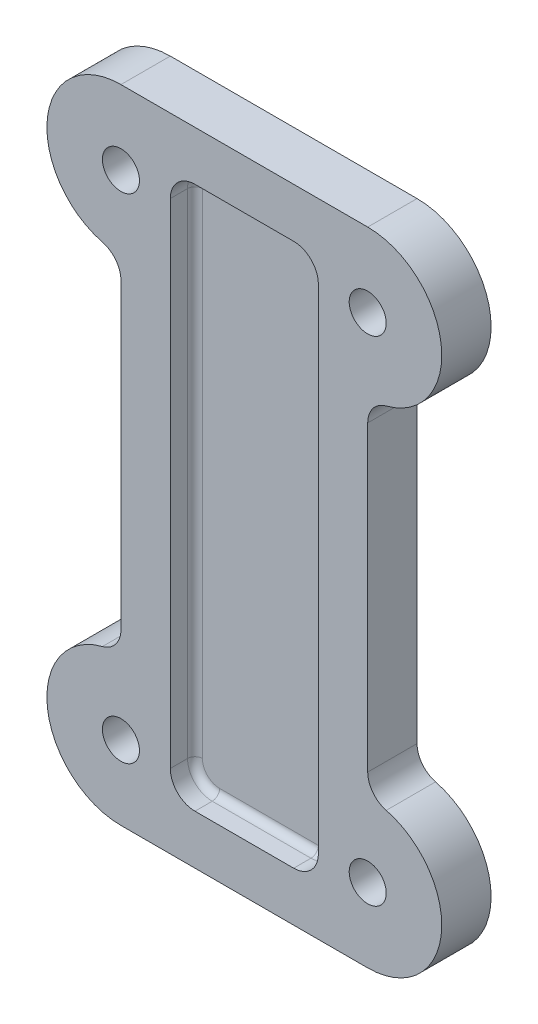
ISO-10303-21;
HEADER;
FILE_DESCRIPTION(('STEP AP214'),'2;1');
FILE_NAME('part.step','',(''),(''),'','','');
FILE_SCHEMA(('AUTOMOTIVE_DESIGN { 1 0 10303 214 1 1 1 1 }'));
ENDSEC;
DATA;
#1=APPLICATION_CONTEXT('core data for automotive mechanical design processes');
#2=APPLICATION_PROTOCOL_DEFINITION('international standard','automotive_design',2000,#1);
#3=PRODUCT_CONTEXT('',#1,'mechanical');
#4=PRODUCT('Part','Part','',(#3));
#5=PRODUCT_RELATED_PRODUCT_CATEGORY('part','',(#4));
#6=PRODUCT_DEFINITION_FORMATION('','',#4);
#7=PRODUCT_DEFINITION_CONTEXT('part definition',#1,'design');
#8=PRODUCT_DEFINITION('design','',#6,#7);
#9=PRODUCT_DEFINITION_SHAPE('','',#8);
#10=(LENGTH_UNIT() NAMED_UNIT(*) SI_UNIT(.MILLI.,.METRE.));
#11=(NAMED_UNIT(*) PLANE_ANGLE_UNIT() SI_UNIT($,.RADIAN.));
#12=(NAMED_UNIT(*) SI_UNIT($,.STERADIAN.) SOLID_ANGLE_UNIT());
#13=UNCERTAINTY_MEASURE_WITH_UNIT(LENGTH_MEASURE(1.E-05),#10,'distance_accuracy_value','');
#14=(GEOMETRIC_REPRESENTATION_CONTEXT(3) GLOBAL_UNCERTAINTY_ASSIGNED_CONTEXT((#13)) GLOBAL_UNIT_ASSIGNED_CONTEXT((#10,
#11,#12)) REPRESENTATION_CONTEXT('',''));
#15=CARTESIAN_POINT('',(0.,0.,0.));
#16=DIRECTION('',(0.,0.,1.));
#17=DIRECTION('',(1.,0.,0.));
#18=AXIS2_PLACEMENT_3D('',#15,#16,#17);
#19=CARTESIAN_POINT('',(0.,-41.275,3.175));
#20=DIRECTION('',(0.,-1.,0.));
#21=DIRECTION('',(0.,0.,-1.));
#22=AXIS2_PLACEMENT_3D('',#19,#20,#21);
#23=PLANE('',#22);
#24=DIRECTION('',(-1.,0.,0.));
#25=VECTOR('',#24,1.);
#26=CARTESIAN_POINT('',(0.,-41.275,0.));
#27=LINE('',#26,#25);
#28=CARTESIAN_POINT('',(15.875,-41.275,0.));
#29=VERTEX_POINT('',#28);
#30=CARTESIAN_POINT('',(-15.875,-41.275,0.));
#31=VERTEX_POINT('',#30);
#32=EDGE_CURVE('E201',#29,#31,#27,.T.);
#33=ORIENTED_EDGE('',*,*,#32,.F.);
#34=DIRECTION('',(0.,0.,-1.));
#35=VECTOR('',#34,1.);
#36=CARTESIAN_POINT('',(15.875,-41.275,3.175));
#37=LINE('',#36,#35);
#38=CARTESIAN_POINT('',(15.875,-41.275,6.35));
#39=VERTEX_POINT('',#38);
#40=EDGE_CURVE('E196',#39,#29,#37,.T.);
#41=ORIENTED_EDGE('',*,*,#40,.F.);
#42=DIRECTION('',(1.,0.,0.));
#43=VECTOR('',#42,1.);
#44=CARTESIAN_POINT('',(0.,-41.275,6.35));
#45=LINE('',#44,#43);
#46=CARTESIAN_POINT('',(-15.875,-41.275,6.35));
#47=VERTEX_POINT('',#46);
#48=EDGE_CURVE('E199',#47,#39,#45,.T.);
#49=ORIENTED_EDGE('',*,*,#48,.F.);
#50=DIRECTION('',(0.,0.,-1.));
#51=VECTOR('',#50,1.);
#52=CARTESIAN_POINT('',(-15.875,-41.275,3.175));
#53=LINE('',#52,#51);
#54=EDGE_CURVE('E352',#47,#31,#53,.T.);
#55=ORIENTED_EDGE('',*,*,#54,.T.);
#56=EDGE_LOOP('',(#33,#41,#49,#55));
#57=FACE_BOUND('',#56,.T.);
#58=ADVANCED_FACE('F33',(#57),#23,.T.);
#59=CARTESIAN_POINT('',(15.875,-31.75,3.175));
#60=DIRECTION('',(0.,0.,-1.));
#61=DIRECTION('',(-1.,0.,0.));
#62=AXIS2_PLACEMENT_3D('',#59,#60,#61);
#63=CYLINDRICAL_SURFACE('',#62,9.525);
#64=CARTESIAN_POINT('',(15.875,-31.75,0.));
#65=DIRECTION('',(0.,0.,1.));
#66=DIRECTION('',(1.,0.,0.));
#67=AXIS2_PLACEMENT_3D('',#64,#65,#66);
#68=CIRCLE('',#67,9.525);
#69=CARTESIAN_POINT('',(18.25625,-22.5274584068436,0.));
#70=VERTEX_POINT('',#69);
#71=EDGE_CURVE('E311',#29,#70,#68,.T.);
#72=ORIENTED_EDGE('',*,*,#71,.T.);
#73=DIRECTION('',(0.,0.,-1.));
#74=VECTOR('',#73,1.);
#75=CARTESIAN_POINT('',(18.25625,-22.5274584068436,3.175));
#76=LINE('',#75,#74);
#77=CARTESIAN_POINT('',(18.25625,-22.5274584068436,6.35));
#78=VERTEX_POINT('',#77);
#79=EDGE_CURVE('E206',#78,#70,#76,.T.);
#80=ORIENTED_EDGE('',*,*,#79,.F.);
#81=CARTESIAN_POINT('',(15.875,-31.75,6.35));
#82=DIRECTION('',(0.,0.,1.));
#83=DIRECTION('',(1.,0.,0.));
#84=AXIS2_PLACEMENT_3D('',#81,#82,#83);
#85=CIRCLE('',#84,9.525);
#86=EDGE_CURVE('E209',#39,#78,#85,.T.);
#87=ORIENTED_EDGE('',*,*,#86,.F.);
#88=ORIENTED_EDGE('',*,*,#40,.T.);
#89=EDGE_LOOP('',(#72,#80,#87,#88));
#90=FACE_BOUND('',#89,.T.);
#91=ADVANCED_FACE('F210',(#90),#63,.T.);
#92=CARTESIAN_POINT('',(19.05,-19.4532778757914,3.175));
#93=DIRECTION('',(0.,0.,-1.));
#94=DIRECTION('',(-1.,0.,0.));
#95=AXIS2_PLACEMENT_3D('',#92,#93,#94);
#96=CYLINDRICAL_SURFACE('',#95,3.175);
#97=CARTESIAN_POINT('',(19.05,-19.4532778757914,0.));
#98=DIRECTION('',(0.,0.,1.));
#99=DIRECTION('',(1.,0.,0.));
#100=AXIS2_PLACEMENT_3D('',#97,#98,#99);
#101=CIRCLE('',#100,3.175);
#102=CARTESIAN_POINT('',(15.875,-19.4532778757914,0.));
#103=VERTEX_POINT('',#102);
#104=EDGE_CURVE('E313',#70,#103,#101,.F.);
#105=ORIENTED_EDGE('',*,*,#104,.T.);
#106=DIRECTION('',(0.,0.,-1.));
#107=VECTOR('',#106,1.);
#108=CARTESIAN_POINT('',(15.875,-19.4532778757914,3.175));
#109=LINE('',#108,#107);
#110=CARTESIAN_POINT('',(15.875,-19.4532778757914,6.35));
#111=VERTEX_POINT('',#110);
#112=EDGE_CURVE('E373',#111,#103,#109,.T.);
#113=ORIENTED_EDGE('',*,*,#112,.F.);
#114=CARTESIAN_POINT('',(19.05,-19.4532778757914,6.35));
#115=DIRECTION('',(0.,0.,1.));
#116=DIRECTION('',(1.,0.,0.));
#117=AXIS2_PLACEMENT_3D('',#114,#115,#116);
#118=CIRCLE('',#117,3.175);
#119=EDGE_CURVE('E215',#78,#111,#118,.F.);
#120=ORIENTED_EDGE('',*,*,#119,.F.);
#121=ORIENTED_EDGE('',*,*,#79,.T.);
#122=EDGE_LOOP('',(#105,#113,#120,#121));
#123=FACE_BOUND('',#122,.T.);
#124=ADVANCED_FACE('F487',(#123),#96,.F.);
#125=CARTESIAN_POINT('',(15.875,0.,3.175));
#126=DIRECTION('',(-1.,0.,0.));
#127=DIRECTION('',(0.,0.,1.));
#128=AXIS2_PLACEMENT_3D('',#125,#126,#127);
#129=PLANE('',#128);
#130=DIRECTION('',(0.,1.,0.));
#131=VECTOR('',#130,1.);
#132=CARTESIAN_POINT('',(15.875,0.,0.));
#133=LINE('',#132,#131);
#134=CARTESIAN_POINT('',(15.875,19.4532778757914,0.));
#135=VERTEX_POINT('',#134);
#136=EDGE_CURVE('E316',#103,#135,#133,.T.);
#137=ORIENTED_EDGE('',*,*,#136,.T.);
#138=DIRECTION('',(0.,0.,-1.));
#139=VECTOR('',#138,1.);
#140=CARTESIAN_POINT('',(15.875,19.4532778757914,3.175));
#141=LINE('',#140,#139);
#142=CARTESIAN_POINT('',(15.875,19.4532778757914,6.35));
#143=VERTEX_POINT('',#142);
#144=EDGE_CURVE('E371',#143,#135,#141,.T.);
#145=ORIENTED_EDGE('',*,*,#144,.F.);
#146=DIRECTION('',(0.,1.,0.));
#147=VECTOR('',#146,1.);
#148=CARTESIAN_POINT('',(15.875,0.,6.35));
#149=LINE('',#148,#147);
#150=EDGE_CURVE('E228',#111,#143,#149,.T.);
#151=ORIENTED_EDGE('',*,*,#150,.F.);
#152=ORIENTED_EDGE('',*,*,#112,.T.);
#153=EDGE_LOOP('',(#137,#145,#151,#152));
#154=FACE_BOUND('',#153,.T.);
#155=ADVANCED_FACE('F748',(#154),#129,.F.);
#156=CARTESIAN_POINT('',(19.05,19.4532778757914,3.175));
#157=DIRECTION('',(0.,0.,-1.));
#158=DIRECTION('',(-1.,0.,0.));
#159=AXIS2_PLACEMENT_3D('',#156,#157,#158);
#160=CYLINDRICAL_SURFACE('',#159,3.175);
#161=CARTESIAN_POINT('',(19.05,19.4532778757914,0.));
#162=DIRECTION('',(0.,0.,1.));
#163=DIRECTION('',(1.,0.,0.));
#164=AXIS2_PLACEMENT_3D('',#161,#162,#163);
#165=CIRCLE('',#164,3.175);
#166=CARTESIAN_POINT('',(18.25625,22.5274584068436,0.));
#167=VERTEX_POINT('',#166);
#168=EDGE_CURVE('E319',#167,#135,#165,.T.);
#169=ORIENTED_EDGE('',*,*,#168,.F.);
#170=DIRECTION('',(0.,0.,-1.));
#171=VECTOR('',#170,1.);
#172=CARTESIAN_POINT('',(18.25625,22.5274584068436,3.175));
#173=LINE('',#172,#171);
#174=CARTESIAN_POINT('',(18.25625,22.5274584068436,6.35));
#175=VERTEX_POINT('',#174);
#176=EDGE_CURVE('E369',#175,#167,#173,.T.);
#177=ORIENTED_EDGE('',*,*,#176,.F.);
#178=CARTESIAN_POINT('',(19.05,19.4532778757914,6.35));
#179=DIRECTION('',(0.,0.,1.));
#180=DIRECTION('',(1.,0.,0.));
#181=AXIS2_PLACEMENT_3D('',#178,#179,#180);
#182=CIRCLE('',#181,3.175);
#183=EDGE_CURVE('E231',#143,#175,#182,.F.);
#184=ORIENTED_EDGE('',*,*,#183,.F.);
#185=ORIENTED_EDGE('',*,*,#144,.T.);
#186=EDGE_LOOP('',(#169,#177,#184,#185));
#187=FACE_BOUND('',#186,.T.);
#188=ADVANCED_FACE('F737',(#187),#160,.F.);
#189=CARTESIAN_POINT('',(15.875,31.75,3.175));
#190=DIRECTION('',(0.,0.,-1.));
#191=DIRECTION('',(-1.,0.,0.));
#192=AXIS2_PLACEMENT_3D('',#189,#190,#191);
#193=CYLINDRICAL_SURFACE('',#192,9.52500000000001);
#194=CARTESIAN_POINT('',(15.875,31.75,0.));
#195=DIRECTION('',(0.,0.,1.));
#196=DIRECTION('',(1.,0.,0.));
#197=AXIS2_PLACEMENT_3D('',#194,#195,#196);
#198=CIRCLE('',#197,9.52500000000001);
#199=CARTESIAN_POINT('',(15.875,41.275,0.));
#200=VERTEX_POINT('',#199);
#201=EDGE_CURVE('E322',#167,#200,#198,.T.);
#202=ORIENTED_EDGE('',*,*,#201,.T.);
#203=DIRECTION('',(0.,0.,-1.));
#204=VECTOR('',#203,1.);
#205=CARTESIAN_POINT('',(15.875,41.275,3.175));
#206=LINE('',#205,#204);
#207=CARTESIAN_POINT('',(15.875,41.275,6.35));
#208=VERTEX_POINT('',#207);
#209=EDGE_CURVE('E366',#208,#200,#206,.T.);
#210=ORIENTED_EDGE('',*,*,#209,.F.);
#211=CARTESIAN_POINT('',(15.875,31.75,6.35));
#212=DIRECTION('',(0.,0.,1.));
#213=DIRECTION('',(1.,0.,0.));
#214=AXIS2_PLACEMENT_3D('',#211,#212,#213);
#215=CIRCLE('',#214,9.52500000000001);
#216=EDGE_CURVE('E234',#175,#208,#215,.T.);
#217=ORIENTED_EDGE('',*,*,#216,.F.);
#218=ORIENTED_EDGE('',*,*,#176,.T.);
#219=EDGE_LOOP('',(#202,#210,#217,#218));
#220=FACE_BOUND('',#219,.T.);
#221=ADVANCED_FACE('F726',(#220),#193,.T.);
#222=CARTESIAN_POINT('',(0.,41.275,3.175));
#223=DIRECTION('',(0.,-1.,0.));
#224=DIRECTION('',(0.,0.,-1.));
#225=AXIS2_PLACEMENT_3D('',#222,#223,#224);
#226=PLANE('',#225);
#227=DIRECTION('',(-1.,0.,0.));
#228=VECTOR('',#227,1.);
#229=CARTESIAN_POINT('',(0.,41.275,0.));
#230=LINE('',#229,#228);
#231=CARTESIAN_POINT('',(-15.875,41.275,0.));
#232=VERTEX_POINT('',#231);
#233=EDGE_CURVE('E325',#200,#232,#230,.T.);
#234=ORIENTED_EDGE('',*,*,#233,.T.);
#235=DIRECTION('',(0.,0.,-1.));
#236=VECTOR('',#235,1.);
#237=CARTESIAN_POINT('',(-15.875,41.275,3.175));
#238=LINE('',#237,#236);
#239=CARTESIAN_POINT('',(-15.875,41.275,6.35));
#240=VERTEX_POINT('',#239);
#241=EDGE_CURVE('E363',#240,#232,#238,.T.);
#242=ORIENTED_EDGE('',*,*,#241,.F.);
#243=DIRECTION('',(-1.,0.,0.));
#244=VECTOR('',#243,1.);
#245=CARTESIAN_POINT('',(0.,41.275,6.35));
#246=LINE('',#245,#244);
#247=EDGE_CURVE('E237',#208,#240,#246,.T.);
#248=ORIENTED_EDGE('',*,*,#247,.F.);
#249=ORIENTED_EDGE('',*,*,#209,.T.);
#250=EDGE_LOOP('',(#234,#242,#248,#249));
#251=FACE_BOUND('',#250,.T.);
#252=ADVANCED_FACE('F715',(#251),#226,.F.);
#253=CARTESIAN_POINT('',(-15.875,31.75,3.175));
#254=DIRECTION('',(0.,0.,-1.));
#255=DIRECTION('',(-1.,0.,0.));
#256=AXIS2_PLACEMENT_3D('',#253,#254,#255);
#257=CYLINDRICAL_SURFACE('',#256,9.52500000000001);
#258=CARTESIAN_POINT('',(-15.875,31.75,0.));
#259=DIRECTION('',(0.,0.,1.));
#260=DIRECTION('',(1.,0.,0.));
#261=AXIS2_PLACEMENT_3D('',#258,#259,#260);
#262=CIRCLE('',#261,9.52500000000001);
#263=CARTESIAN_POINT('',(-18.25625,22.5274584068436,0.));
#264=VERTEX_POINT('',#263);
#265=EDGE_CURVE('E328',#232,#264,#262,.T.);
#266=ORIENTED_EDGE('',*,*,#265,.T.);
#267=DIRECTION('',(0.,0.,-1.));
#268=VECTOR('',#267,1.);
#269=CARTESIAN_POINT('',(-18.25625,22.5274584068436,3.175));
#270=LINE('',#269,#268);
#271=CARTESIAN_POINT('',(-18.25625,22.5274584068436,6.35));
#272=VERTEX_POINT('',#271);
#273=EDGE_CURVE('E360',#272,#264,#270,.T.);
#274=ORIENTED_EDGE('',*,*,#273,.F.);
#275=CARTESIAN_POINT('',(-15.875,31.75,6.35));
#276=DIRECTION('',(0.,0.,1.));
#277=DIRECTION('',(1.,0.,0.));
#278=AXIS2_PLACEMENT_3D('',#275,#276,#277);
#279=CIRCLE('',#278,9.52500000000001);
#280=EDGE_CURVE('E240',#240,#272,#279,.T.);
#281=ORIENTED_EDGE('',*,*,#280,.F.);
#282=ORIENTED_EDGE('',*,*,#241,.T.);
#283=EDGE_LOOP('',(#266,#274,#281,#282));
#284=FACE_BOUND('',#283,.T.);
#285=ADVANCED_FACE('F704',(#284),#257,.T.);
#286=CARTESIAN_POINT('',(-19.05,19.4532778757914,3.175));
#287=DIRECTION('',(0.,0.,-1.));
#288=DIRECTION('',(-1.,0.,0.));
#289=AXIS2_PLACEMENT_3D('',#286,#287,#288);
#290=CYLINDRICAL_SURFACE('',#289,3.175);
#291=CARTESIAN_POINT('',(-19.05,19.4532778757914,0.));
#292=DIRECTION('',(0.,0.,1.));
#293=DIRECTION('',(1.,0.,0.));
#294=AXIS2_PLACEMENT_3D('',#291,#292,#293);
#295=CIRCLE('',#294,3.175);
#296=CARTESIAN_POINT('',(-15.875,19.4532778757914,0.));
#297=VERTEX_POINT('',#296);
#298=EDGE_CURVE('E331',#264,#297,#295,.F.);
#299=ORIENTED_EDGE('',*,*,#298,.T.);
#300=DIRECTION('',(0.,0.,-1.));
#301=VECTOR('',#300,1.);
#302=CARTESIAN_POINT('',(-15.875,19.4532778757914,3.175));
#303=LINE('',#302,#301);
#304=CARTESIAN_POINT('',(-15.875,19.4532778757914,6.35));
#305=VERTEX_POINT('',#304);
#306=EDGE_CURVE('E358',#305,#297,#303,.T.);
#307=ORIENTED_EDGE('',*,*,#306,.F.);
#308=CARTESIAN_POINT('',(-19.05,19.4532778757914,6.35));
#309=DIRECTION('',(0.,0.,1.));
#310=DIRECTION('',(1.,0.,0.));
#311=AXIS2_PLACEMENT_3D('',#308,#309,#310);
#312=CIRCLE('',#311,3.175);
#313=EDGE_CURVE('E243',#272,#305,#312,.F.);
#314=ORIENTED_EDGE('',*,*,#313,.F.);
#315=ORIENTED_EDGE('',*,*,#273,.T.);
#316=EDGE_LOOP('',(#299,#307,#314,#315));
#317=FACE_BOUND('',#316,.T.);
#318=ADVANCED_FACE('F693',(#317),#290,.F.);
#319=CARTESIAN_POINT('',(-15.875,0.,3.175));
#320=DIRECTION('',(-1.,0.,0.));
#321=DIRECTION('',(0.,0.,1.));
#322=AXIS2_PLACEMENT_3D('',#319,#320,#321);
#323=PLANE('',#322);
#324=DIRECTION('',(0.,1.,0.));
#325=VECTOR('',#324,1.);
#326=CARTESIAN_POINT('',(-15.875,0.,0.));
#327=LINE('',#326,#325);
#328=CARTESIAN_POINT('',(-15.875,-19.4532778757914,0.));
#329=VERTEX_POINT('',#328);
#330=EDGE_CURVE('E334',#329,#297,#327,.T.);
#331=ORIENTED_EDGE('',*,*,#330,.F.);
#332=DIRECTION('',(0.,0.,-1.));
#333=VECTOR('',#332,1.);
#334=CARTESIAN_POINT('',(-15.875,-19.4532778757914,3.175));
#335=LINE('',#334,#333);
#336=CARTESIAN_POINT('',(-15.875,-19.4532778757914,6.35));
#337=VERTEX_POINT('',#336);
#338=EDGE_CURVE('E356',#337,#329,#335,.T.);
#339=ORIENTED_EDGE('',*,*,#338,.F.);
#340=DIRECTION('',(0.,-1.,0.));
#341=VECTOR('',#340,1.);
#342=CARTESIAN_POINT('',(-15.875,0.,6.35));
#343=LINE('',#342,#341);
#344=EDGE_CURVE('E246',#305,#337,#343,.T.);
#345=ORIENTED_EDGE('',*,*,#344,.F.);
#346=ORIENTED_EDGE('',*,*,#306,.T.);
#347=EDGE_LOOP('',(#331,#339,#345,#346));
#348=FACE_BOUND('',#347,.T.);
#349=ADVANCED_FACE('F682',(#348),#323,.T.);
#350=CARTESIAN_POINT('',(-19.05,-19.4532778757914,3.175));
#351=DIRECTION('',(0.,0.,-1.));
#352=DIRECTION('',(-1.,0.,0.));
#353=AXIS2_PLACEMENT_3D('',#350,#351,#352);
#354=CYLINDRICAL_SURFACE('',#353,3.175);
#355=CARTESIAN_POINT('',(-19.05,-19.4532778757914,0.));
#356=DIRECTION('',(0.,0.,1.));
#357=DIRECTION('',(1.,0.,0.));
#358=AXIS2_PLACEMENT_3D('',#355,#356,#357);
#359=CIRCLE('',#358,3.175);
#360=CARTESIAN_POINT('',(-18.25625,-22.5274584068436,0.));
#361=VERTEX_POINT('',#360);
#362=EDGE_CURVE('E337',#361,#329,#359,.T.);
#363=ORIENTED_EDGE('',*,*,#362,.F.);
#364=DIRECTION('',(0.,0.,-1.));
#365=VECTOR('',#364,1.);
#366=CARTESIAN_POINT('',(-18.25625,-22.5274584068436,3.175));
#367=LINE('',#366,#365);
#368=CARTESIAN_POINT('',(-18.25625,-22.5274584068436,6.35));
#369=VERTEX_POINT('',#368);
#370=EDGE_CURVE('E354',#369,#361,#367,.T.);
#371=ORIENTED_EDGE('',*,*,#370,.F.);
#372=CARTESIAN_POINT('',(-19.05,-19.4532778757914,6.35));
#373=DIRECTION('',(0.,0.,1.));
#374=DIRECTION('',(1.,0.,0.));
#375=AXIS2_PLACEMENT_3D('',#372,#373,#374);
#376=CIRCLE('',#375,3.175);
#377=EDGE_CURVE('E249',#337,#369,#376,.F.);
#378=ORIENTED_EDGE('',*,*,#377,.F.);
#379=ORIENTED_EDGE('',*,*,#338,.T.);
#380=EDGE_LOOP('',(#363,#371,#378,#379));
#381=FACE_BOUND('',#380,.T.);
#382=ADVANCED_FACE('F671',(#381),#354,.F.);
#383=CARTESIAN_POINT('',(15.875,31.75,3.175));
#384=DIRECTION('',(0.,0.,-1.));
#385=DIRECTION('',(-1.,0.,0.));
#386=AXIS2_PLACEMENT_3D('',#383,#384,#385);
#387=CYLINDRICAL_SURFACE('',#386,2.38125);
#388=CARTESIAN_POINT('',(15.875,31.75,0.));
#389=DIRECTION('',(0.,0.,1.));
#390=DIRECTION('',(1.,0.,0.));
#391=AXIS2_PLACEMENT_3D('',#388,#389,#390);
#392=CIRCLE('',#391,2.38125);
#393=CARTESIAN_POINT('',(18.25625,31.75,0.));
#394=VERTEX_POINT('',#393);
#395=EDGE_CURVE('E346',#394,#394,#392,.T.);
#396=ORIENTED_EDGE('',*,*,#395,.F.);
#397=EDGE_LOOP('',(#396));
#398=FACE_BOUND('',#397,.T.);
#399=CARTESIAN_POINT('',(15.875,31.75,6.35));
#400=DIRECTION('',(0.,0.,1.));
#401=DIRECTION('',(1.,0.,0.));
#402=AXIS2_PLACEMENT_3D('',#399,#400,#401);
#403=CIRCLE('',#402,2.38125);
#404=CARTESIAN_POINT('',(18.25625,31.75,6.35));
#405=VERTEX_POINT('',#404);
#406=EDGE_CURVE('E252',#405,#405,#403,.F.);
#407=ORIENTED_EDGE('',*,*,#406,.F.);
#408=EDGE_LOOP('',(#407));
#409=FACE_BOUND('',#408,.T.);
#410=ADVANCED_FACE('F660',(#398,#409),#387,.F.);
#411=CARTESIAN_POINT('',(15.875,-31.75,3.175));
#412=DIRECTION('',(0.,0.,-1.));
#413=DIRECTION('',(-1.,0.,0.));
#414=AXIS2_PLACEMENT_3D('',#411,#412,#413);
#415=CYLINDRICAL_SURFACE('',#414,2.38125);
#416=CARTESIAN_POINT('',(15.875,-31.75,0.));
#417=DIRECTION('',(0.,0.,1.));
#418=DIRECTION('',(1.,0.,0.));
#419=AXIS2_PLACEMENT_3D('',#416,#417,#418);
#420=CIRCLE('',#419,2.38125);
#421=CARTESIAN_POINT('',(18.25625,-31.75,0.));
#422=VERTEX_POINT('',#421);
#423=EDGE_CURVE('E343',#422,#422,#420,.T.);
#424=ORIENTED_EDGE('',*,*,#423,.F.);
#425=EDGE_LOOP('',(#424));
#426=FACE_BOUND('',#425,.T.);
#427=CARTESIAN_POINT('',(15.875,-31.75,6.35));
#428=DIRECTION('',(0.,0.,1.));
#429=DIRECTION('',(1.,0.,0.));
#430=AXIS2_PLACEMENT_3D('',#427,#428,#429);
#431=CIRCLE('',#430,2.38125);
#432=CARTESIAN_POINT('',(18.25625,-31.75,6.35));
#433=VERTEX_POINT('',#432);
#434=EDGE_CURVE('E255',#433,#433,#431,.F.);
#435=ORIENTED_EDGE('',*,*,#434,.F.);
#436=EDGE_LOOP('',(#435));
#437=FACE_BOUND('',#436,.T.);
#438=ADVANCED_FACE('F649',(#426,#437),#415,.F.);
#439=CARTESIAN_POINT('',(-15.875,-31.75,3.175));
#440=DIRECTION('',(0.,0.,-1.));
#441=DIRECTION('',(-1.,0.,0.));
#442=AXIS2_PLACEMENT_3D('',#439,#440,#441);
#443=CYLINDRICAL_SURFACE('',#442,9.525);
#444=CARTESIAN_POINT('',(-15.875,-31.75,0.));
#445=DIRECTION('',(0.,0.,1.));
#446=DIRECTION('',(1.,0.,0.));
#447=AXIS2_PLACEMENT_3D('',#444,#445,#446);
#448=CIRCLE('',#447,9.525);
#449=EDGE_CURVE('E340',#361,#31,#448,.T.);
#450=ORIENTED_EDGE('',*,*,#449,.T.);
#451=ORIENTED_EDGE('',*,*,#54,.F.);
#452=CARTESIAN_POINT('',(-15.875,-31.75,6.35));
#453=DIRECTION('',(0.,0.,1.));
#454=DIRECTION('',(1.,0.,0.));
#455=AXIS2_PLACEMENT_3D('',#452,#453,#454);
#456=CIRCLE('',#455,9.525);
#457=EDGE_CURVE('E222',#369,#47,#456,.T.);
#458=ORIENTED_EDGE('',*,*,#457,.F.);
#459=ORIENTED_EDGE('',*,*,#370,.T.);
#460=EDGE_LOOP('',(#450,#451,#458,#459));
#461=FACE_BOUND('',#460,.T.);
#462=ADVANCED_FACE('F495',(#461),#443,.T.);
#463=CARTESIAN_POINT('',(-15.875,-31.75,3.175));
#464=DIRECTION('',(0.,0.,-1.));
#465=DIRECTION('',(-1.,0.,0.));
#466=AXIS2_PLACEMENT_3D('',#463,#464,#465);
#467=CYLINDRICAL_SURFACE('',#466,2.38125);
#468=CARTESIAN_POINT('',(-15.875,-31.75,0.));
#469=DIRECTION('',(0.,0.,1.));
#470=DIRECTION('',(1.,0.,0.));
#471=AXIS2_PLACEMENT_3D('',#468,#469,#470);
#472=CIRCLE('',#471,2.38125);
#473=CARTESIAN_POINT('',(-13.49375,-31.75,0.));
#474=VERTEX_POINT('',#473);
#475=EDGE_CURVE('E307',#474,#474,#472,.T.);
#476=ORIENTED_EDGE('',*,*,#475,.F.);
#477=EDGE_LOOP('',(#476));
#478=FACE_BOUND('',#477,.T.);
#479=CARTESIAN_POINT('',(-15.875,-31.75,6.35));
#480=DIRECTION('',(0.,0.,1.));
#481=DIRECTION('',(1.,0.,0.));
#482=AXIS2_PLACEMENT_3D('',#479,#480,#481);
#483=CIRCLE('',#482,2.38125);
#484=CARTESIAN_POINT('',(-13.49375,-31.75,6.35));
#485=VERTEX_POINT('',#484);
#486=EDGE_CURVE('E261',#485,#485,#483,.F.);
#487=ORIENTED_EDGE('',*,*,#486,.F.);
#488=EDGE_LOOP('',(#487));
#489=FACE_BOUND('',#488,.T.);
#490=ADVANCED_FACE('F491',(#478,#489),#467,.F.);
#491=CARTESIAN_POINT('',(-15.875,31.75,3.175));
#492=DIRECTION('',(0.,0.,-1.));
#493=DIRECTION('',(-1.,0.,0.));
#494=AXIS2_PLACEMENT_3D('',#491,#492,#493);
#495=CYLINDRICAL_SURFACE('',#494,2.38125);
#496=CARTESIAN_POINT('',(-15.875,31.75,0.));
#497=DIRECTION('',(0.,0.,1.));
#498=DIRECTION('',(1.,0.,0.));
#499=AXIS2_PLACEMENT_3D('',#496,#497,#498);
#500=CIRCLE('',#499,2.38125);
#501=CARTESIAN_POINT('',(-13.49375,31.75,0.));
#502=VERTEX_POINT('',#501);
#503=EDGE_CURVE('E349',#502,#502,#500,.T.);
#504=ORIENTED_EDGE('',*,*,#503,.F.);
#505=EDGE_LOOP('',(#504));
#506=FACE_BOUND('',#505,.T.);
#507=CARTESIAN_POINT('',(-15.875,31.75,6.35));
#508=DIRECTION('',(0.,0.,1.));
#509=DIRECTION('',(1.,0.,0.));
#510=AXIS2_PLACEMENT_3D('',#507,#508,#509);
#511=CIRCLE('',#510,2.38125);
#512=CARTESIAN_POINT('',(-13.49375,31.75,6.35));
#513=VERTEX_POINT('',#512);
#514=EDGE_CURVE('E258',#513,#513,#511,.F.);
#515=ORIENTED_EDGE('',*,*,#514,.F.);
#516=EDGE_LOOP('',(#515));
#517=FACE_BOUND('',#516,.T.);
#518=ADVANCED_FACE('F494',(#506,#517),#495,.F.);
#519=CARTESIAN_POINT('',(0.,0.,0.));
#520=DIRECTION('',(0.,0.,1.));
#521=DIRECTION('',(1.,0.,0.));
#522=AXIS2_PLACEMENT_3D('',#519,#520,#521);
#523=PLANE('',#522);
#524=ORIENTED_EDGE('',*,*,#475,.T.);
#525=EDGE_LOOP('',(#524));
#526=FACE_BOUND('',#525,.T.);
#527=ORIENTED_EDGE('',*,*,#32,.T.);
#528=ORIENTED_EDGE('',*,*,#449,.F.);
#529=ORIENTED_EDGE('',*,*,#362,.T.);
#530=ORIENTED_EDGE('',*,*,#330,.T.);
#531=ORIENTED_EDGE('',*,*,#298,.F.);
#532=ORIENTED_EDGE('',*,*,#265,.F.);
#533=ORIENTED_EDGE('',*,*,#233,.F.);
#534=ORIENTED_EDGE('',*,*,#201,.F.);
#535=ORIENTED_EDGE('',*,*,#168,.T.);
#536=ORIENTED_EDGE('',*,*,#136,.F.);
#537=ORIENTED_EDGE('',*,*,#104,.F.);
#538=ORIENTED_EDGE('',*,*,#71,.F.);
#539=EDGE_LOOP('',(#527,#528,#529,#530,#531,#532,#533,#534,#535,#536,#537,#538));
#540=FACE_BOUND('',#539,.T.);
#541=ORIENTED_EDGE('',*,*,#423,.T.);
#542=EDGE_LOOP('',(#541));
#543=FACE_BOUND('',#542,.T.);
#544=ORIENTED_EDGE('',*,*,#395,.T.);
#545=EDGE_LOOP('',(#544));
#546=FACE_BOUND('',#545,.T.);
#547=ORIENTED_EDGE('',*,*,#503,.T.);
#548=EDGE_LOOP('',(#547));
#549=FACE_BOUND('',#548,.T.);
#550=ADVANCED_FACE('F621',(#526,#540,#543,#546,#549),#523,.F.);
#551=CARTESIAN_POINT('',(-6.35,31.75,6.35));
#552=DIRECTION('',(0.,0.,-1.));
#553=DIRECTION('',(-1.,0.,0.));
#554=AXIS2_PLACEMENT_3D('',#551,#552,#553);
#555=CYLINDRICAL_SURFACE('',#554,3.175);
#556=DIRECTION('',(0.,0.,-1.));
#557=VECTOR('',#556,1.);
#558=CARTESIAN_POINT('',(-9.525,31.75,6.35));
#559=LINE('',#558,#557);
#560=CARTESIAN_POINT('',(-9.525,31.75,6.35));
#561=VERTEX_POINT('',#560);
#562=CARTESIAN_POINT('',(-9.525,31.75,4.1275));
#563=VERTEX_POINT('',#562);
#564=EDGE_CURVE('E286',#561,#563,#559,.T.);
#565=ORIENTED_EDGE('',*,*,#564,.T.);
#566=CARTESIAN_POINT('',(-6.35,31.75,4.1275));
#567=DIRECTION('',(0.,0.,1.));
#568=DIRECTION('',(1.,0.,0.));
#569=AXIS2_PLACEMENT_3D('',#566,#567,#568);
#570=CIRCLE('',#569,3.175);
#571=CARTESIAN_POINT('',(-6.34999999999998,34.925,4.1275));
#572=VERTEX_POINT('',#571);
#573=EDGE_CURVE('E11',#563,#572,#570,.F.);
#574=ORIENTED_EDGE('',*,*,#573,.T.);
#575=DIRECTION('',(0.,0.,-1.));
#576=VECTOR('',#575,1.);
#577=CARTESIAN_POINT('',(-6.34999999999998,34.925,6.35));
#578=LINE('',#577,#576);
#579=CARTESIAN_POINT('',(-6.34999999999998,34.925,6.35));
#580=VERTEX_POINT('',#579);
#581=EDGE_CURVE('E304',#580,#572,#578,.T.);
#582=ORIENTED_EDGE('',*,*,#581,.F.);
#583=CARTESIAN_POINT('',(-6.35,31.75,6.35));
#584=DIRECTION('',(0.,0.,1.));
#585=DIRECTION('',(1.,0.,0.));
#586=AXIS2_PLACEMENT_3D('',#583,#584,#585);
#587=CIRCLE('',#586,3.175);
#588=EDGE_CURVE('E264',#580,#561,#587,.T.);
#589=ORIENTED_EDGE('',*,*,#588,.T.);
#590=EDGE_LOOP('',(#565,#574,#582,#589));
#591=FACE_BOUND('',#590,.T.);
#592=ADVANCED_FACE('F613',(#591),#555,.F.);
#593=CARTESIAN_POINT('',(0.,34.925,6.35));
#594=DIRECTION('',(0.,1.,0.));
#595=DIRECTION('',(0.,0.,1.));
#596=AXIS2_PLACEMENT_3D('',#593,#594,#595);
#597=PLANE('',#596);
#598=ORIENTED_EDGE('',*,*,#581,.T.);
#599=DIRECTION('',(1.,0.,0.));
#600=VECTOR('',#599,1.);
#601=CARTESIAN_POINT('',(0.,34.925,4.1275));
#602=LINE('',#601,#600);
#603=CARTESIAN_POINT('',(6.34999999999997,34.925,4.1275));
#604=VERTEX_POINT('',#603);
#605=EDGE_CURVE('E205',#572,#604,#602,.T.);
#606=ORIENTED_EDGE('',*,*,#605,.T.);
#607=DIRECTION('',(0.,0.,-1.));
#608=VECTOR('',#607,1.);
#609=CARTESIAN_POINT('',(6.34999999999997,34.925,6.35));
#610=LINE('',#609,#608);
#611=CARTESIAN_POINT('',(6.34999999999997,34.925,6.35));
#612=VERTEX_POINT('',#611);
#613=EDGE_CURVE('E301',#612,#604,#610,.T.);
#614=ORIENTED_EDGE('',*,*,#613,.F.);
#615=DIRECTION('',(1.,0.,0.));
#616=VECTOR('',#615,1.);
#617=CARTESIAN_POINT('',(0.,34.925,6.35));
#618=LINE('',#617,#616);
#619=EDGE_CURVE('E267',#580,#612,#618,.T.);
#620=ORIENTED_EDGE('',*,*,#619,.F.);
#621=EDGE_LOOP('',(#598,#606,#614,#620));
#622=FACE_BOUND('',#621,.T.);
#623=ADVANCED_FACE('F604',(#622),#597,.F.);
#624=CARTESIAN_POINT('',(6.35,31.75,6.35));
#625=DIRECTION('',(0.,0.,-1.));
#626=DIRECTION('',(-1.,0.,0.));
#627=AXIS2_PLACEMENT_3D('',#624,#625,#626);
#628=CYLINDRICAL_SURFACE('',#627,3.175);
#629=ORIENTED_EDGE('',*,*,#613,.T.);
#630=CARTESIAN_POINT('',(6.35,31.75,4.1275));
#631=DIRECTION('',(0.,0.,1.));
#632=DIRECTION('',(1.,0.,0.));
#633=AXIS2_PLACEMENT_3D('',#630,#631,#632);
#634=CIRCLE('',#633,3.175);
#635=CARTESIAN_POINT('',(9.525,31.75,4.1275));
#636=VERTEX_POINT('',#635);
#637=EDGE_CURVE('E396',#604,#636,#634,.F.);
#638=ORIENTED_EDGE('',*,*,#637,.T.);
#639=DIRECTION('',(0.,0.,-1.));
#640=VECTOR('',#639,1.);
#641=CARTESIAN_POINT('',(9.525,31.75,6.35));
#642=LINE('',#641,#640);
#643=CARTESIAN_POINT('',(9.525,31.75,6.35));
#644=VERTEX_POINT('',#643);
#645=EDGE_CURVE('E298',#644,#636,#642,.T.);
#646=ORIENTED_EDGE('',*,*,#645,.F.);
#647=CARTESIAN_POINT('',(6.35,31.75,6.35));
#648=DIRECTION('',(0.,0.,1.));
#649=DIRECTION('',(1.,0.,0.));
#650=AXIS2_PLACEMENT_3D('',#647,#648,#649);
#651=CIRCLE('',#650,3.175);
#652=EDGE_CURVE('E270',#612,#644,#651,.F.);
#653=ORIENTED_EDGE('',*,*,#652,.F.);
#654=EDGE_LOOP('',(#629,#638,#646,#653));
#655=FACE_BOUND('',#654,.T.);
#656=ADVANCED_FACE('F596',(#655),#628,.F.);
#657=CARTESIAN_POINT('',(9.525,0.,6.35));
#658=DIRECTION('',(1.,0.,0.));
#659=DIRECTION('',(0.,1.,0.));
#660=AXIS2_PLACEMENT_3D('',#657,#658,#659);
#661=PLANE('',#660);
#662=ORIENTED_EDGE('',*,*,#645,.T.);
#663=DIRECTION('',(0.,-1.,0.));
#664=VECTOR('',#663,1.);
#665=CARTESIAN_POINT('',(9.525,0.,4.1275));
#666=LINE('',#665,#664);
#667=CARTESIAN_POINT('',(9.525,-31.75,4.1275));
#668=VERTEX_POINT('',#667);
#669=EDGE_CURVE('E398',#636,#668,#666,.T.);
#670=ORIENTED_EDGE('',*,*,#669,.T.);
#671=DIRECTION('',(0.,0.,-1.));
#672=VECTOR('',#671,1.);
#673=CARTESIAN_POINT('',(9.525,-31.75,6.35));
#674=LINE('',#673,#672);
#675=CARTESIAN_POINT('',(9.525,-31.75,6.35));
#676=VERTEX_POINT('',#675);
#677=EDGE_CURVE('E295',#676,#668,#674,.T.);
#678=ORIENTED_EDGE('',*,*,#677,.F.);
#679=DIRECTION('',(0.,-1.,0.));
#680=VECTOR('',#679,1.);
#681=CARTESIAN_POINT('',(9.525,0.,6.35));
#682=LINE('',#681,#680);
#683=EDGE_CURVE('E273',#644,#676,#682,.T.);
#684=ORIENTED_EDGE('',*,*,#683,.F.);
#685=EDGE_LOOP('',(#662,#670,#678,#684));
#686=FACE_BOUND('',#685,.T.);
#687=ADVANCED_FACE('F445',(#686),#661,.F.);
#688=CARTESIAN_POINT('',(6.35,-31.75,6.35));
#689=DIRECTION('',(0.,0.,-1.));
#690=DIRECTION('',(-1.,0.,0.));
#691=AXIS2_PLACEMENT_3D('',#688,#689,#690);
#692=CYLINDRICAL_SURFACE('',#691,3.175);
#693=ORIENTED_EDGE('',*,*,#677,.T.);
#694=CARTESIAN_POINT('',(6.35,-31.75,4.1275));
#695=DIRECTION('',(0.,0.,1.));
#696=DIRECTION('',(1.,0.,0.));
#697=AXIS2_PLACEMENT_3D('',#694,#695,#696);
#698=CIRCLE('',#697,3.175);
#699=CARTESIAN_POINT('',(6.34999999999998,-34.925,4.1275));
#700=VERTEX_POINT('',#699);
#701=EDGE_CURVE('E400',#668,#700,#698,.F.);
#702=ORIENTED_EDGE('',*,*,#701,.T.);
#703=DIRECTION('',(0.,0.,-1.));
#704=VECTOR('',#703,1.);
#705=CARTESIAN_POINT('',(6.34999999999998,-34.925,6.35));
#706=LINE('',#705,#704);
#707=CARTESIAN_POINT('',(6.34999999999998,-34.925,6.35));
#708=VERTEX_POINT('',#707);
#709=EDGE_CURVE('E292',#708,#700,#706,.T.);
#710=ORIENTED_EDGE('',*,*,#709,.F.);
#711=CARTESIAN_POINT('',(6.35,-31.75,6.35));
#712=DIRECTION('',(0.,0.,1.));
#713=DIRECTION('',(1.,0.,0.));
#714=AXIS2_PLACEMENT_3D('',#711,#712,#713);
#715=CIRCLE('',#714,3.175);
#716=EDGE_CURVE('E275',#708,#676,#715,.T.);
#717=ORIENTED_EDGE('',*,*,#716,.T.);
#718=EDGE_LOOP('',(#693,#702,#710,#717));
#719=FACE_BOUND('',#718,.T.);
#720=ADVANCED_FACE('F443',(#719),#692,.F.);
#721=CARTESIAN_POINT('',(0.,-34.925,6.35));
#722=DIRECTION('',(0.,1.,0.));
#723=DIRECTION('',(0.,0.,1.));
#724=AXIS2_PLACEMENT_3D('',#721,#722,#723);
#725=PLANE('',#724);
#726=ORIENTED_EDGE('',*,*,#709,.T.);
#727=DIRECTION('',(1.,0.,0.));
#728=VECTOR('',#727,1.);
#729=CARTESIAN_POINT('',(-6.34999999999997,-34.925,4.1275));
#730=LINE('',#729,#728);
#731=CARTESIAN_POINT('',(-6.34999999999997,-34.925,4.1275));
#732=VERTEX_POINT('',#731);
#733=EDGE_CURVE('E402',#700,#732,#730,.F.);
#734=ORIENTED_EDGE('',*,*,#733,.T.);
#735=DIRECTION('',(0.,0.,-1.));
#736=VECTOR('',#735,1.);
#737=CARTESIAN_POINT('',(-6.34999999999997,-34.925,6.35));
#738=LINE('',#737,#736);
#739=CARTESIAN_POINT('',(-6.34999999999997,-34.925,6.35));
#740=VERTEX_POINT('',#739);
#741=EDGE_CURVE('E290',#740,#732,#738,.T.);
#742=ORIENTED_EDGE('',*,*,#741,.F.);
#743=DIRECTION('',(1.,0.,0.));
#744=VECTOR('',#743,1.);
#745=CARTESIAN_POINT('',(0.,-34.925,6.35));
#746=LINE('',#745,#744);
#747=EDGE_CURVE('E278',#740,#708,#746,.T.);
#748=ORIENTED_EDGE('',*,*,#747,.T.);
#749=EDGE_LOOP('',(#726,#734,#742,#748));
#750=FACE_BOUND('',#749,.T.);
#751=ADVANCED_FACE('F433',(#750),#725,.T.);
#752=CARTESIAN_POINT('',(-6.34999999999999,-31.75,6.35));
#753=DIRECTION('',(0.,0.,-1.));
#754=DIRECTION('',(-1.,0.,0.));
#755=AXIS2_PLACEMENT_3D('',#752,#753,#754);
#756=CYLINDRICAL_SURFACE('',#755,3.175);
#757=ORIENTED_EDGE('',*,*,#741,.T.);
#758=CARTESIAN_POINT('',(-6.34999999999999,-31.75,4.1275));
#759=DIRECTION('',(0.,0.,1.));
#760=DIRECTION('',(1.,0.,0.));
#761=AXIS2_PLACEMENT_3D('',#758,#759,#760);
#762=CIRCLE('',#761,3.175);
#763=CARTESIAN_POINT('',(-9.52499999999999,-31.75,4.1275));
#764=VERTEX_POINT('',#763);
#765=EDGE_CURVE('E57',#732,#764,#762,.F.);
#766=ORIENTED_EDGE('',*,*,#765,.T.);
#767=DIRECTION('',(0.,0.,-1.));
#768=VECTOR('',#767,1.);
#769=CARTESIAN_POINT('',(-9.52499999999999,-31.75,6.35));
#770=LINE('',#769,#768);
#771=CARTESIAN_POINT('',(-9.52499999999999,-31.75,6.35));
#772=VERTEX_POINT('',#771);
#773=EDGE_CURVE('E288',#772,#764,#770,.T.);
#774=ORIENTED_EDGE('',*,*,#773,.F.);
#775=CARTESIAN_POINT('',(-6.34999999999999,-31.75,6.35));
#776=DIRECTION('',(0.,0.,1.));
#777=DIRECTION('',(1.,0.,0.));
#778=AXIS2_PLACEMENT_3D('',#775,#776,#777);
#779=CIRCLE('',#778,3.175);
#780=EDGE_CURVE('E281',#740,#772,#779,.F.);
#781=ORIENTED_EDGE('',*,*,#780,.F.);
#782=EDGE_LOOP('',(#757,#766,#774,#781));
#783=FACE_BOUND('',#782,.T.);
#784=ADVANCED_FACE('F435',(#783),#756,.F.);
#785=CARTESIAN_POINT('',(-9.525,0.,6.35));
#786=DIRECTION('',(1.,0.,0.));
#787=DIRECTION('',(0.,1.,0.));
#788=AXIS2_PLACEMENT_3D('',#785,#786,#787);
#789=PLANE('',#788);
#790=ORIENTED_EDGE('',*,*,#773,.T.);
#791=DIRECTION('',(0.,-1.,0.));
#792=VECTOR('',#791,1.);
#793=CARTESIAN_POINT('',(-9.525,31.75,4.1275));
#794=LINE('',#793,#792);
#795=EDGE_CURVE('E42',#764,#563,#794,.F.);
#796=ORIENTED_EDGE('',*,*,#795,.T.);
#797=ORIENTED_EDGE('',*,*,#564,.F.);
#798=DIRECTION('',(0.,-1.,0.));
#799=VECTOR('',#798,1.);
#800=CARTESIAN_POINT('',(-9.525,0.,6.35));
#801=LINE('',#800,#799);
#802=EDGE_CURVE('E283',#561,#772,#801,.T.);
#803=ORIENTED_EDGE('',*,*,#802,.T.);
#804=EDGE_LOOP('',(#790,#796,#797,#803));
#805=FACE_BOUND('',#804,.T.);
#806=ADVANCED_FACE('F558',(#805),#789,.T.);
#807=CARTESIAN_POINT('',(0.,0.,6.35));
#808=DIRECTION('',(0.,0.,1.));
#809=DIRECTION('',(1.,0.,0.));
#810=AXIS2_PLACEMENT_3D('',#807,#808,#809);
#811=PLANE('',#810);
#812=ORIENTED_EDGE('',*,*,#48,.T.);
#813=ORIENTED_EDGE('',*,*,#86,.T.);
#814=ORIENTED_EDGE('',*,*,#119,.T.);
#815=ORIENTED_EDGE('',*,*,#150,.T.);
#816=ORIENTED_EDGE('',*,*,#183,.T.);
#817=ORIENTED_EDGE('',*,*,#216,.T.);
#818=ORIENTED_EDGE('',*,*,#247,.T.);
#819=ORIENTED_EDGE('',*,*,#280,.T.);
#820=ORIENTED_EDGE('',*,*,#313,.T.);
#821=ORIENTED_EDGE('',*,*,#344,.T.);
#822=ORIENTED_EDGE('',*,*,#377,.T.);
#823=ORIENTED_EDGE('',*,*,#457,.T.);
#824=EDGE_LOOP('',(#812,#813,#814,#815,#816,#817,#818,#819,#820,#821,#822,#823));
#825=FACE_BOUND('',#824,.T.);
#826=ORIENTED_EDGE('',*,*,#406,.T.);
#827=EDGE_LOOP('',(#826));
#828=FACE_BOUND('',#827,.T.);
#829=ORIENTED_EDGE('',*,*,#434,.T.);
#830=EDGE_LOOP('',(#829));
#831=FACE_BOUND('',#830,.T.);
#832=ORIENTED_EDGE('',*,*,#514,.T.);
#833=EDGE_LOOP('',(#832));
#834=FACE_BOUND('',#833,.T.);
#835=ORIENTED_EDGE('',*,*,#486,.T.);
#836=EDGE_LOOP('',(#835));
#837=FACE_BOUND('',#836,.T.);
#838=ORIENTED_EDGE('',*,*,#588,.F.);
#839=ORIENTED_EDGE('',*,*,#619,.T.);
#840=ORIENTED_EDGE('',*,*,#652,.T.);
#841=ORIENTED_EDGE('',*,*,#683,.T.);
#842=ORIENTED_EDGE('',*,*,#716,.F.);
#843=ORIENTED_EDGE('',*,*,#747,.F.);
#844=ORIENTED_EDGE('',*,*,#780,.T.);
#845=ORIENTED_EDGE('',*,*,#802,.F.);
#846=EDGE_LOOP('',(#838,#839,#840,#841,#842,#843,#844,#845));
#847=FACE_BOUND('',#846,.T.);
#848=ADVANCED_FACE('F218',(#825,#828,#831,#834,#837,#847),#811,.T.);
#849=CARTESIAN_POINT('',(0.,0.,3.175));
#850=DIRECTION('',(0.,0.,1.));
#851=DIRECTION('',(1.,0.,0.));
#852=AXIS2_PLACEMENT_3D('',#849,#850,#851);
#853=PLANE('',#852);
#854=CARTESIAN_POINT('',(6.35,31.75,3.175));
#855=DIRECTION('',(0.,0.,1.));
#856=DIRECTION('',(1.,0.,0.));
#857=AXIS2_PLACEMENT_3D('',#854,#855,#856);
#858=CIRCLE('',#857,2.2225);
#859=CARTESIAN_POINT('',(8.5725,31.75,3.175));
#860=VERTEX_POINT('',#859);
#861=CARTESIAN_POINT('',(6.34999999999997,33.9725,3.175));
#862=VERTEX_POINT('',#861);
#863=EDGE_CURVE('E391',#860,#862,#858,.T.);
#864=ORIENTED_EDGE('',*,*,#863,.T.);
#865=DIRECTION('',(1.,0.,0.));
#866=VECTOR('',#865,1.);
#867=CARTESIAN_POINT('',(0.,33.9725,3.175));
#868=LINE('',#867,#866);
#869=CARTESIAN_POINT('',(-6.34999999999998,33.9725,3.175));
#870=VERTEX_POINT('',#869);
#871=EDGE_CURVE('E393',#862,#870,#868,.F.);
#872=ORIENTED_EDGE('',*,*,#871,.T.);
#873=CARTESIAN_POINT('',(-6.35,31.75,3.175));
#874=DIRECTION('',(0.,0.,1.));
#875=DIRECTION('',(1.,0.,0.));
#876=AXIS2_PLACEMENT_3D('',#873,#874,#875);
#877=CIRCLE('',#876,2.2225);
#878=CARTESIAN_POINT('',(-8.5725,31.75,3.175));
#879=VERTEX_POINT('',#878);
#880=EDGE_CURVE('E379',#870,#879,#877,.T.);
#881=ORIENTED_EDGE('',*,*,#880,.T.);
#882=DIRECTION('',(0.,-1.,0.));
#883=VECTOR('',#882,1.);
#884=CARTESIAN_POINT('',(-8.57249999999999,-31.75,3.175));
#885=LINE('',#884,#883);
#886=CARTESIAN_POINT('',(-8.57249999999999,-31.75,3.175));
#887=VERTEX_POINT('',#886);
#888=EDGE_CURVE('E381',#879,#887,#885,.T.);
#889=ORIENTED_EDGE('',*,*,#888,.T.);
#890=CARTESIAN_POINT('',(-6.34999999999999,-31.75,3.175));
#891=DIRECTION('',(0.,0.,1.));
#892=DIRECTION('',(1.,0.,0.));
#893=AXIS2_PLACEMENT_3D('',#890,#891,#892);
#894=CIRCLE('',#893,2.2225);
#895=CARTESIAN_POINT('',(-6.34999999999997,-33.9725,3.175));
#896=VERTEX_POINT('',#895);
#897=EDGE_CURVE('E383',#887,#896,#894,.T.);
#898=ORIENTED_EDGE('',*,*,#897,.T.);
#899=DIRECTION('',(1.,0.,0.));
#900=VECTOR('',#899,1.);
#901=CARTESIAN_POINT('',(6.34999999999998,-33.9725,3.175));
#902=LINE('',#901,#900);
#903=CARTESIAN_POINT('',(6.34999999999999,-33.9725,3.175));
#904=VERTEX_POINT('',#903);
#905=EDGE_CURVE('E385',#896,#904,#902,.T.);
#906=ORIENTED_EDGE('',*,*,#905,.T.);
#907=CARTESIAN_POINT('',(6.35,-31.75,3.175));
#908=DIRECTION('',(0.,0.,1.));
#909=DIRECTION('',(1.,0.,0.));
#910=AXIS2_PLACEMENT_3D('',#907,#908,#909);
#911=CIRCLE('',#910,2.2225);
#912=CARTESIAN_POINT('',(8.5725,-31.75,3.175));
#913=VERTEX_POINT('',#912);
#914=EDGE_CURVE('E387',#904,#913,#911,.T.);
#915=ORIENTED_EDGE('',*,*,#914,.T.);
#916=DIRECTION('',(0.,-1.,0.));
#917=VECTOR('',#916,1.);
#918=CARTESIAN_POINT('',(8.5725,0.,3.175));
#919=LINE('',#918,#917);
#920=EDGE_CURVE('E389',#913,#860,#919,.F.);
#921=ORIENTED_EDGE('',*,*,#920,.T.);
#922=EDGE_LOOP('',(#864,#872,#881,#889,#898,#906,#915,#921));
#923=FACE_BOUND('',#922,.T.);
#924=ADVANCED_FACE('F459',(#923),#853,.T.);
#925=CARTESIAN_POINT('',(0.,-33.9725,4.1275));
#926=DIRECTION('',(-1.,0.,0.));
#927=DIRECTION('',(0.,0.,1.));
#928=AXIS2_PLACEMENT_3D('',#925,#926,#927);
#929=CYLINDRICAL_SURFACE('',#928,0.9525);
#930=CARTESIAN_POINT('',(6.34999999999999,-33.9725,4.1275));
#931=DIRECTION('',(-1.,0.,0.));
#932=DIRECTION('',(0.,-1.,0.));
#933=AXIS2_PLACEMENT_3D('',#930,#931,#932);
#934=CIRCLE('',#933,0.9525);
#935=EDGE_CURVE('E225',#904,#700,#934,.T.);
#936=ORIENTED_EDGE('',*,*,#935,.F.);
#937=ORIENTED_EDGE('',*,*,#905,.F.);
#938=CARTESIAN_POINT('',(-6.34999999999997,-33.9725,4.1275));
#939=DIRECTION('',(1.,0.,0.));
#940=DIRECTION('',(0.,0.,-1.));
#941=AXIS2_PLACEMENT_3D('',#938,#939,#940);
#942=CIRCLE('',#941,0.9525);
#943=EDGE_CURVE('E37',#732,#896,#942,.T.);
#944=ORIENTED_EDGE('',*,*,#943,.F.);
#945=ORIENTED_EDGE('',*,*,#733,.F.);
#946=EDGE_LOOP('',(#936,#937,#944,#945));
#947=FACE_BOUND('',#946,.T.);
#948=ADVANCED_FACE('F35',(#947),#929,.F.);
#949=CARTESIAN_POINT('',(-6.34999999999999,-31.75,4.1275));
#950=DIRECTION('',(0.,0.,1.));
#951=DIRECTION('',(1.,0.,0.));
#952=AXIS2_PLACEMENT_3D('',#949,#950,#951);
#953=TOROIDAL_SURFACE('',#952,2.2225,0.9525);
#954=ORIENTED_EDGE('',*,*,#943,.T.);
#955=ORIENTED_EDGE('',*,*,#897,.F.);
#956=CARTESIAN_POINT('',(-8.57249999999999,-31.75,4.1275));
#957=DIRECTION('',(0.,-1.,0.));
#958=DIRECTION('',(1.,0.,0.));
#959=AXIS2_PLACEMENT_3D('',#956,#957,#958);
#960=CIRCLE('',#959,0.9525);
#961=EDGE_CURVE('E419',#764,#887,#960,.T.);
#962=ORIENTED_EDGE('',*,*,#961,.F.);
#963=ORIENTED_EDGE('',*,*,#765,.F.);
#964=EDGE_LOOP('',(#954,#955,#962,#963));
#965=FACE_BOUND('',#964,.T.);
#966=ADVANCED_FACE('F475',(#965),#953,.F.);
#967=CARTESIAN_POINT('',(6.35,-31.75,4.1275));
#968=DIRECTION('',(0.,0.,1.));
#969=DIRECTION('',(1.,0.,0.));
#970=AXIS2_PLACEMENT_3D('',#967,#968,#969);
#971=TOROIDAL_SURFACE('',#970,2.2225,0.9525);
#972=ORIENTED_EDGE('',*,*,#935,.T.);
#973=ORIENTED_EDGE('',*,*,#701,.F.);
#974=CARTESIAN_POINT('',(8.5725,-31.75,4.1275));
#975=DIRECTION('',(0.,-1.,0.));
#976=DIRECTION('',(0.,0.,-1.));
#977=AXIS2_PLACEMENT_3D('',#974,#975,#976);
#978=CIRCLE('',#977,0.9525);
#979=EDGE_CURVE('E416',#913,#668,#978,.T.);
#980=ORIENTED_EDGE('',*,*,#979,.F.);
#981=ORIENTED_EDGE('',*,*,#914,.F.);
#982=EDGE_LOOP('',(#972,#973,#980,#981));
#983=FACE_BOUND('',#982,.T.);
#984=ADVANCED_FACE('F426',(#983),#971,.F.);
#985=CARTESIAN_POINT('',(-8.57249999999999,0.,4.1275));
#986=DIRECTION('',(0.,1.,0.));
#987=DIRECTION('',(-1.,0.,0.));
#988=AXIS2_PLACEMENT_3D('',#985,#986,#987);
#989=CYLINDRICAL_SURFACE('',#988,0.9525);
#990=ORIENTED_EDGE('',*,*,#961,.T.);
#991=ORIENTED_EDGE('',*,*,#888,.F.);
#992=CARTESIAN_POINT('',(-8.5725,31.75,4.1275));
#993=DIRECTION('',(0.,-1.,0.));
#994=DIRECTION('',(0.,0.,-1.));
#995=AXIS2_PLACEMENT_3D('',#992,#993,#994);
#996=CIRCLE('',#995,0.9525);
#997=EDGE_CURVE('E413',#563,#879,#996,.T.);
#998=ORIENTED_EDGE('',*,*,#997,.F.);
#999=ORIENTED_EDGE('',*,*,#795,.F.);
#1000=EDGE_LOOP('',(#990,#991,#998,#999));
#1001=FACE_BOUND('',#1000,.T.);
#1002=ADVANCED_FACE('F472',(#1001),#989,.F.);
#1003=CARTESIAN_POINT('',(8.5725,0.,4.1275));
#1004=DIRECTION('',(0.,-1.,0.));
#1005=DIRECTION('',(1.,0.,0.));
#1006=AXIS2_PLACEMENT_3D('',#1003,#1004,#1005);
#1007=CYLINDRICAL_SURFACE('',#1006,0.9525);
#1008=ORIENTED_EDGE('',*,*,#979,.T.);
#1009=ORIENTED_EDGE('',*,*,#669,.F.);
#1010=CARTESIAN_POINT('',(8.5725,31.75,4.1275));
#1011=DIRECTION('',(0.,-1.,0.));
#1012=DIRECTION('',(1.,0.,0.));
#1013=AXIS2_PLACEMENT_3D('',#1010,#1011,#1012);
#1014=CIRCLE('',#1013,0.9525);
#1015=EDGE_CURVE('E410',#860,#636,#1014,.T.);
#1016=ORIENTED_EDGE('',*,*,#1015,.F.);
#1017=ORIENTED_EDGE('',*,*,#920,.F.);
#1018=EDGE_LOOP('',(#1008,#1009,#1016,#1017));
#1019=FACE_BOUND('',#1018,.T.);
#1020=ADVANCED_FACE('F450',(#1019),#1007,.F.);
#1021=CARTESIAN_POINT('',(-6.35,31.75,4.1275));
#1022=DIRECTION('',(0.,0.,1.));
#1023=DIRECTION('',(1.,0.,0.));
#1024=AXIS2_PLACEMENT_3D('',#1021,#1022,#1023);
#1025=TOROIDAL_SURFACE('',#1024,2.2225,0.9525);
#1026=ORIENTED_EDGE('',*,*,#997,.T.);
#1027=ORIENTED_EDGE('',*,*,#880,.F.);
#1028=CARTESIAN_POINT('',(-6.34999999999999,33.9725,4.1275));
#1029=DIRECTION('',(-1.,0.,0.));
#1030=DIRECTION('',(0.,-1.,0.));
#1031=AXIS2_PLACEMENT_3D('',#1028,#1029,#1030);
#1032=CIRCLE('',#1031,0.9525);
#1033=EDGE_CURVE('E408',#572,#870,#1032,.T.);
#1034=ORIENTED_EDGE('',*,*,#1033,.F.);
#1035=ORIENTED_EDGE('',*,*,#573,.F.);
#1036=EDGE_LOOP('',(#1026,#1027,#1034,#1035));
#1037=FACE_BOUND('',#1036,.T.);
#1038=ADVANCED_FACE('F467',(#1037),#1025,.F.);
#1039=CARTESIAN_POINT('',(6.35,31.75,4.1275));
#1040=DIRECTION('',(0.,0.,1.));
#1041=DIRECTION('',(1.,0.,0.));
#1042=AXIS2_PLACEMENT_3D('',#1039,#1040,#1041);
#1043=TOROIDAL_SURFACE('',#1042,2.2225,0.9525);
#1044=ORIENTED_EDGE('',*,*,#1015,.T.);
#1045=ORIENTED_EDGE('',*,*,#637,.F.);
#1046=CARTESIAN_POINT('',(6.34999999999997,33.9725,4.1275));
#1047=DIRECTION('',(1.,0.,0.));
#1048=DIRECTION('',(0.,0.,-1.));
#1049=AXIS2_PLACEMENT_3D('',#1046,#1047,#1048);
#1050=CIRCLE('',#1049,0.9525);
#1051=EDGE_CURVE('E406',#862,#604,#1050,.T.);
#1052=ORIENTED_EDGE('',*,*,#1051,.F.);
#1053=ORIENTED_EDGE('',*,*,#863,.F.);
#1054=EDGE_LOOP('',(#1044,#1045,#1052,#1053));
#1055=FACE_BOUND('',#1054,.T.);
#1056=ADVANCED_FACE('F455',(#1055),#1043,.F.);
#1057=CARTESIAN_POINT('',(0.,33.9725,4.1275));
#1058=DIRECTION('',(1.,0.,0.));
#1059=DIRECTION('',(0.,0.,-1.));
#1060=AXIS2_PLACEMENT_3D('',#1057,#1058,#1059);
#1061=CYLINDRICAL_SURFACE('',#1060,0.9525);
#1062=ORIENTED_EDGE('',*,*,#1033,.T.);
#1063=ORIENTED_EDGE('',*,*,#871,.F.);
#1064=ORIENTED_EDGE('',*,*,#1051,.T.);
#1065=ORIENTED_EDGE('',*,*,#605,.F.);
#1066=EDGE_LOOP('',(#1062,#1063,#1064,#1065));
#1067=FACE_BOUND('',#1066,.T.);
#1068=ADVANCED_FACE('F461',(#1067),#1061,.F.);
#1069=CLOSED_SHELL('',(#58,#91,#124,#155,#188,#221,#252,#285,#318,#349,#382,#410,#438,#462,#490,
#518,#550,#592,#623,#656,#687,#720,#751,#784,#806,#848,#924,#948,#966,#984,#1002,#1020,#1038,
#1056,#1068));
#1070=MANIFOLD_SOLID_BREP('B2',#1069);
#1071=ADVANCED_BREP_SHAPE_REPRESENTATION('',(#18,#1070),#14);
#1072=SHAPE_DEFINITION_REPRESENTATION(#9,#1071);
ENDSEC;
END-ISO-10303-21;
